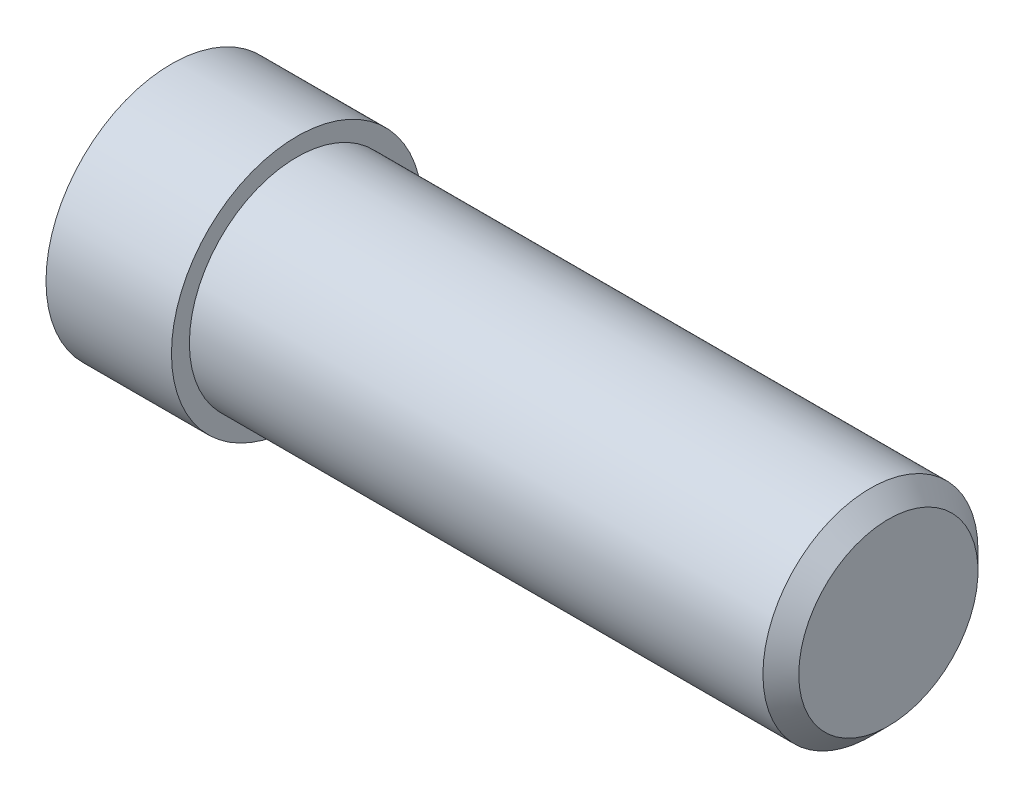
ISO-10303-21;
HEADER;
FILE_DESCRIPTION(('STEP AP214'),'2;1');
FILE_NAME('part.step','',(''),(''),'','','');
FILE_SCHEMA(('AUTOMOTIVE_DESIGN { 1 0 10303 214 1 1 1 1 }'));
ENDSEC;
DATA;
#1=APPLICATION_CONTEXT('core data for automotive mechanical design processes');
#2=APPLICATION_PROTOCOL_DEFINITION('international standard','automotive_design',2000,#1);
#3=PRODUCT_CONTEXT('',#1,'mechanical');
#4=PRODUCT('Part','Part','',(#3));
#5=PRODUCT_RELATED_PRODUCT_CATEGORY('part','',(#4));
#6=PRODUCT_DEFINITION_FORMATION('','',#4);
#7=PRODUCT_DEFINITION_CONTEXT('part definition',#1,'design');
#8=PRODUCT_DEFINITION('design','',#6,#7);
#9=PRODUCT_DEFINITION_SHAPE('','',#8);
#10=(LENGTH_UNIT() NAMED_UNIT(*) SI_UNIT(.MILLI.,.METRE.));
#11=(NAMED_UNIT(*) PLANE_ANGLE_UNIT() SI_UNIT($,.RADIAN.));
#12=(NAMED_UNIT(*) SI_UNIT($,.STERADIAN.) SOLID_ANGLE_UNIT());
#13=UNCERTAINTY_MEASURE_WITH_UNIT(LENGTH_MEASURE(1.E-05),#10,'distance_accuracy_value','');
#14=(GEOMETRIC_REPRESENTATION_CONTEXT(3) GLOBAL_UNCERTAINTY_ASSIGNED_CONTEXT((#13)) GLOBAL_UNIT_ASSIGNED_CONTEXT((#10,
#11,#12)) REPRESENTATION_CONTEXT('',''));
#15=CARTESIAN_POINT('',(0.,0.,0.));
#16=DIRECTION('',(0.,0.,1.));
#17=DIRECTION('',(1.,0.,0.));
#18=AXIS2_PLACEMENT_3D('',#15,#16,#17);
#19=CARTESIAN_POINT('',(-20.,0.,0.));
#20=DIRECTION('',(1.,0.,0.));
#21=DIRECTION('',(0.,0.,-1.));
#22=AXIS2_PLACEMENT_3D('',#19,#20,#21);
#23=PLANE('',#22);
#24=CARTESIAN_POINT('',(-20.,0.,0.));
#25=DIRECTION('',(-1.,0.,0.));
#26=DIRECTION('',(0.,0.,1.));
#27=AXIS2_PLACEMENT_3D('',#24,#25,#26);
#28=CIRCLE('',#27,7.);
#29=CARTESIAN_POINT('',(-20.,0.,7.));
#30=VERTEX_POINT('',#29);
#31=EDGE_CURVE('E52',#30,#30,#28,.T.);
#32=ORIENTED_EDGE('',*,*,#31,.T.);
#33=EDGE_LOOP('',(#32));
#34=FACE_BOUND('',#33,.T.);
#35=ADVANCED_FACE('F39',(#34),#23,.F.);
#36=CARTESIAN_POINT('',(-33.8048780487805,0.,0.));
#37=DIRECTION('',(-1.,0.,0.));
#38=DIRECTION('',(0.,0.,1.));
#39=AXIS2_PLACEMENT_3D('',#36,#37,#38);
#40=CYLINDRICAL_SURFACE('',#39,7.);
#41=ORIENTED_EDGE('',*,*,#31,.F.);
#42=EDGE_LOOP('',(#41));
#43=FACE_BOUND('',#42,.T.);
#44=CARTESIAN_POINT('',(-13.,0.,0.));
#45=DIRECTION('',(-1.,0.,0.));
#46=DIRECTION('',(0.,0.,1.));
#47=AXIS2_PLACEMENT_3D('',#44,#45,#46);
#48=CIRCLE('',#47,7.);
#49=CARTESIAN_POINT('',(-13.,0.,7.));
#50=VERTEX_POINT('',#49);
#51=EDGE_CURVE('E57',#50,#50,#48,.T.);
#52=ORIENTED_EDGE('',*,*,#51,.T.);
#53=EDGE_LOOP('',(#52));
#54=FACE_BOUND('',#53,.T.);
#55=ADVANCED_FACE('F79',(#43,#54),#40,.T.);
#56=CARTESIAN_POINT('',(-13.,7.,0.));
#57=DIRECTION('',(-1.,0.,0.));
#58=DIRECTION('',(0.,0.,1.));
#59=AXIS2_PLACEMENT_3D('',#56,#57,#58);
#60=PLANE('',#59);
#61=ORIENTED_EDGE('',*,*,#51,.F.);
#62=EDGE_LOOP('',(#61));
#63=FACE_BOUND('',#62,.T.);
#64=CARTESIAN_POINT('',(-13.,0.,0.));
#65=DIRECTION('',(-1.,0.,0.));
#66=DIRECTION('',(0.,0.,1.));
#67=AXIS2_PLACEMENT_3D('',#64,#65,#66);
#68=CIRCLE('',#67,6.);
#69=CARTESIAN_POINT('',(-13.,0.,6.));
#70=VERTEX_POINT('',#69);
#71=EDGE_CURVE('E63',#70,#70,#68,.T.);
#72=ORIENTED_EDGE('',*,*,#71,.T.);
#73=EDGE_LOOP('',(#72));
#74=FACE_BOUND('',#73,.T.);
#75=ADVANCED_FACE('F68',(#63,#74),#60,.F.);
#76=CARTESIAN_POINT('',(-33.8048780487805,0.,0.));
#77=DIRECTION('',(-1.,0.,0.));
#78=DIRECTION('',(0.,0.,1.));
#79=AXIS2_PLACEMENT_3D('',#76,#77,#78);
#80=CYLINDRICAL_SURFACE('',#79,6.);
#81=CARTESIAN_POINT('',(19.,0.,0.));
#82=DIRECTION('',(-1.,0.,0.));
#83=DIRECTION('',(0.,0.,1.));
#84=AXIS2_PLACEMENT_3D('',#81,#82,#83);
#85=CIRCLE('',#84,6.);
#86=CARTESIAN_POINT('',(19.,0.,6.));
#87=VERTEX_POINT('',#86);
#88=EDGE_CURVE('E47',#87,#87,#85,.T.);
#89=ORIENTED_EDGE('',*,*,#88,.T.);
#90=EDGE_LOOP('',(#89));
#91=FACE_BOUND('',#90,.T.);
#92=ORIENTED_EDGE('',*,*,#71,.F.);
#93=EDGE_LOOP('',(#92));
#94=FACE_BOUND('',#93,.T.);
#95=ADVANCED_FACE('F70',(#91,#94),#80,.T.);
#96=CARTESIAN_POINT('',(20.,6.,0.));
#97=DIRECTION('',(-1.,0.,0.));
#98=DIRECTION('',(0.,0.,1.));
#99=AXIS2_PLACEMENT_3D('',#96,#97,#98);
#100=PLANE('',#99);
#101=CARTESIAN_POINT('',(20.,0.,0.));
#102=DIRECTION('',(-1.,0.,0.));
#103=DIRECTION('',(0.,0.,1.));
#104=AXIS2_PLACEMENT_3D('',#101,#102,#103);
#105=CIRCLE('',#104,4.99999999999999);
#106=CARTESIAN_POINT('',(20.,0.,4.99999999999999));
#107=VERTEX_POINT('',#106);
#108=EDGE_CURVE('E10',#107,#107,#105,.F.);
#109=ORIENTED_EDGE('',*,*,#108,.T.);
#110=EDGE_LOOP('',(#109));
#111=FACE_BOUND('',#110,.T.);
#112=ADVANCED_FACE('F72',(#111),#100,.F.);
#113=CARTESIAN_POINT('',(19.,0.,0.));
#114=DIRECTION('',(-1.,0.,0.));
#115=DIRECTION('',(0.,0.,1.));
#116=AXIS2_PLACEMENT_3D('',#113,#114,#115);
#117=CONICAL_SURFACE('',#116,6.,0.785398163397447);
#118=ORIENTED_EDGE('',*,*,#108,.F.);
#119=EDGE_LOOP('',(#118));
#120=FACE_BOUND('',#119,.T.);
#121=ORIENTED_EDGE('',*,*,#88,.F.);
#122=EDGE_LOOP('',(#121));
#123=FACE_BOUND('',#122,.T.);
#124=ADVANCED_FACE('F41',(#120,#123),#117,.T.);
#125=CLOSED_SHELL('',(#35,#55,#75,#95,#112,#124));
#126=MANIFOLD_SOLID_BREP('B2',#125);
#127=ADVANCED_BREP_SHAPE_REPRESENTATION('',(#18,#126),#14);
#128=SHAPE_DEFINITION_REPRESENTATION(#9,#127);
ENDSEC;
END-ISO-10303-21;
